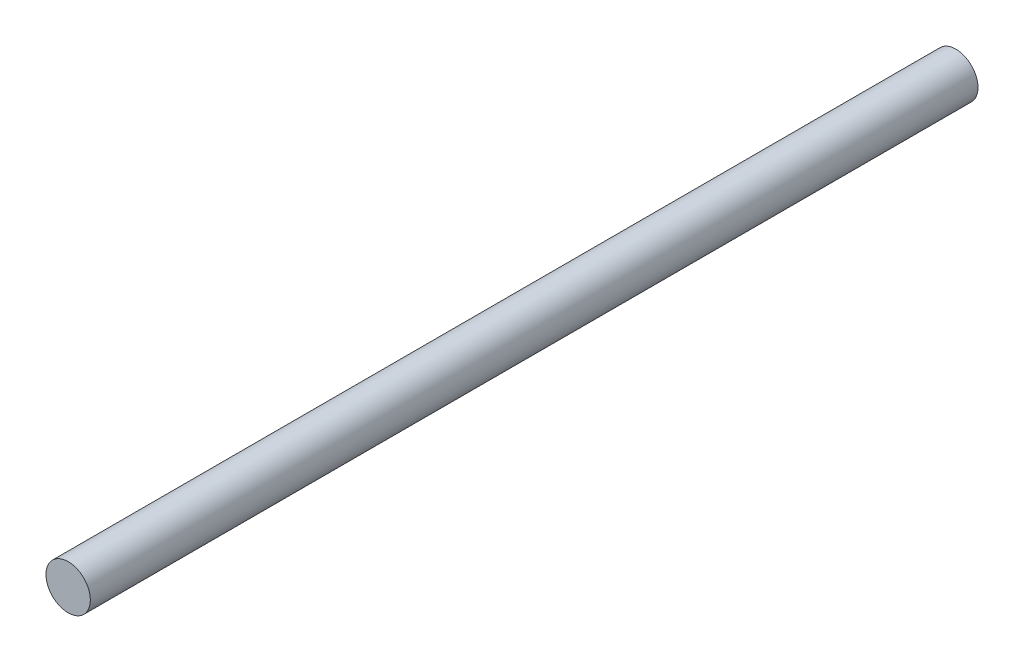
ISO-10303-21;
HEADER;
FILE_DESCRIPTION(('STEP AP214'),'2;1');
FILE_NAME('part.step','',(''),(''),'','','');
FILE_SCHEMA(('AUTOMOTIVE_DESIGN { 1 0 10303 214 1 1 1 1 }'));
ENDSEC;
DATA;
#1=APPLICATION_CONTEXT('core data for automotive mechanical design processes');
#2=APPLICATION_PROTOCOL_DEFINITION('international standard','automotive_design',2000,#1);
#3=PRODUCT_CONTEXT('',#1,'mechanical');
#4=PRODUCT('Part','Part','',(#3));
#5=PRODUCT_RELATED_PRODUCT_CATEGORY('part','',(#4));
#6=PRODUCT_DEFINITION_FORMATION('','',#4);
#7=PRODUCT_DEFINITION_CONTEXT('part definition',#1,'design');
#8=PRODUCT_DEFINITION('design','',#6,#7);
#9=PRODUCT_DEFINITION_SHAPE('','',#8);
#10=(LENGTH_UNIT() NAMED_UNIT(*) SI_UNIT(.MILLI.,.METRE.));
#11=(NAMED_UNIT(*) PLANE_ANGLE_UNIT() SI_UNIT($,.RADIAN.));
#12=(NAMED_UNIT(*) SI_UNIT($,.STERADIAN.) SOLID_ANGLE_UNIT());
#13=UNCERTAINTY_MEASURE_WITH_UNIT(LENGTH_MEASURE(1.E-05),#10,'distance_accuracy_value','');
#14=(GEOMETRIC_REPRESENTATION_CONTEXT(3) GLOBAL_UNCERTAINTY_ASSIGNED_CONTEXT((#13)) GLOBAL_UNIT_ASSIGNED_CONTEXT((#10,
#11,#12)) REPRESENTATION_CONTEXT('',''));
#15=CARTESIAN_POINT('',(0.,0.,0.));
#16=DIRECTION('',(0.,0.,1.));
#17=DIRECTION('',(1.,0.,0.));
#18=AXIS2_PLACEMENT_3D('',#15,#16,#17);
#19=CARTESIAN_POINT('',(0.,0.,190.));
#20=DIRECTION('',(0.,0.,-1.));
#21=DIRECTION('',(-1.,0.,0.));
#22=AXIS2_PLACEMENT_3D('',#19,#20,#21);
#23=CYLINDRICAL_SURFACE('',#22,4.75);
#24=CARTESIAN_POINT('',(0.,0.,190.));
#25=DIRECTION('',(0.,0.,1.));
#26=DIRECTION('',(1.,0.,0.));
#27=AXIS2_PLACEMENT_3D('',#24,#25,#26);
#28=CIRCLE('',#27,4.75);
#29=CARTESIAN_POINT('',(4.75,0.,190.));
#30=VERTEX_POINT('',#29);
#31=EDGE_CURVE('E10',#30,#30,#28,.T.);
#32=ORIENTED_EDGE('',*,*,#31,.F.);
#33=EDGE_LOOP('',(#32));
#34=FACE_BOUND('',#33,.T.);
#35=CARTESIAN_POINT('',(0.,0.,0.));
#36=DIRECTION('',(0.,0.,1.));
#37=DIRECTION('',(1.,0.,0.));
#38=AXIS2_PLACEMENT_3D('',#35,#36,#37);
#39=CIRCLE('',#38,4.75);
#40=CARTESIAN_POINT('',(4.75,0.,0.));
#41=VERTEX_POINT('',#40);
#42=EDGE_CURVE('E34',#41,#41,#39,.T.);
#43=ORIENTED_EDGE('',*,*,#42,.T.);
#44=EDGE_LOOP('',(#43));
#45=FACE_BOUND('',#44,.T.);
#46=ADVANCED_FACE('F31',(#34,#45),#23,.T.);
#47=CARTESIAN_POINT('',(0.,0.,190.));
#48=DIRECTION('',(0.,0.,1.));
#49=DIRECTION('',(1.,0.,0.));
#50=AXIS2_PLACEMENT_3D('',#47,#48,#49);
#51=PLANE('',#50);
#52=ORIENTED_EDGE('',*,*,#31,.T.);
#53=EDGE_LOOP('',(#52));
#54=FACE_BOUND('',#53,.T.);
#55=ADVANCED_FACE('F46',(#54),#51,.T.);
#56=CARTESIAN_POINT('',(0.,0.,0.));
#57=DIRECTION('',(0.,0.,1.));
#58=DIRECTION('',(1.,0.,0.));
#59=AXIS2_PLACEMENT_3D('',#56,#57,#58);
#60=PLANE('',#59);
#61=ORIENTED_EDGE('',*,*,#42,.F.);
#62=EDGE_LOOP('',(#61));
#63=FACE_BOUND('',#62,.T.);
#64=ADVANCED_FACE('F44',(#63),#60,.F.);
#65=CLOSED_SHELL('',(#46,#55,#64));
#66=MANIFOLD_SOLID_BREP('B2',#65);
#67=ADVANCED_BREP_SHAPE_REPRESENTATION('',(#18,#66),#14);
#68=SHAPE_DEFINITION_REPRESENTATION(#9,#67);
ENDSEC;
END-ISO-10303-21;
